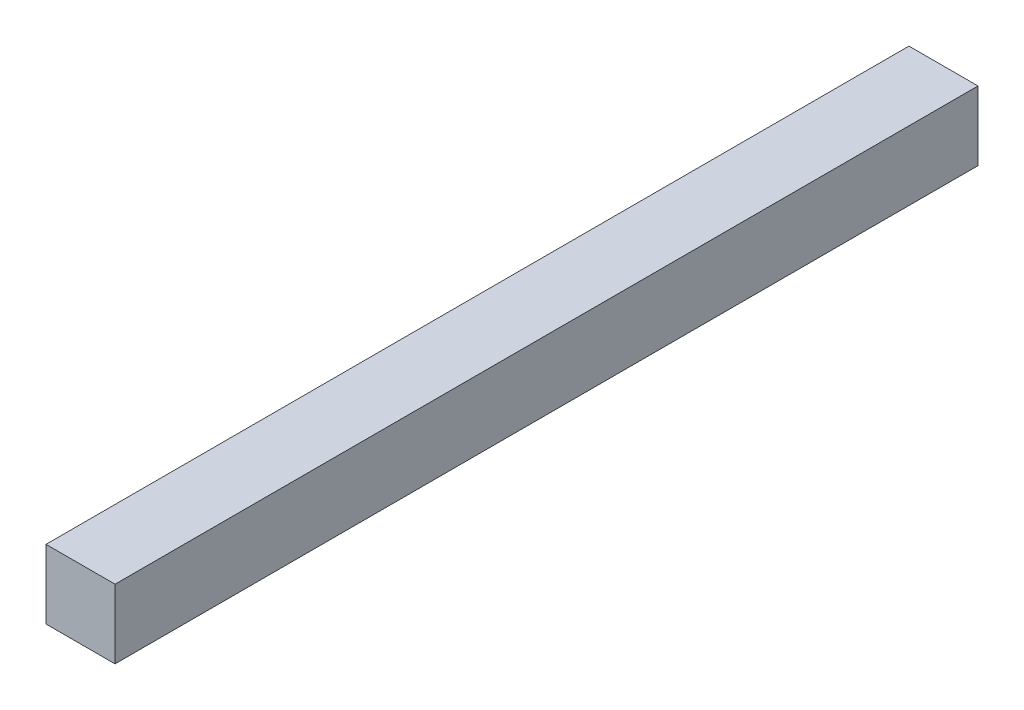
ISO-10303-21;
HEADER;
FILE_DESCRIPTION(('STEP AP214'),'2;1');
FILE_NAME('part.step','',(''),(''),'','','');
FILE_SCHEMA(('AUTOMOTIVE_DESIGN { 1 0 10303 214 1 1 1 1 }'));
ENDSEC;
DATA;
#1=APPLICATION_CONTEXT('core data for automotive mechanical design processes');
#2=APPLICATION_PROTOCOL_DEFINITION('international standard','automotive_design',2000,#1);
#3=PRODUCT_CONTEXT('',#1,'mechanical');
#4=PRODUCT('Part','Part','',(#3));
#5=PRODUCT_RELATED_PRODUCT_CATEGORY('part','',(#4));
#6=PRODUCT_DEFINITION_FORMATION('','',#4);
#7=PRODUCT_DEFINITION_CONTEXT('part definition',#1,'design');
#8=PRODUCT_DEFINITION('design','',#6,#7);
#9=PRODUCT_DEFINITION_SHAPE('','',#8);
#10=(LENGTH_UNIT() NAMED_UNIT(*) SI_UNIT(.MILLI.,.METRE.));
#11=(NAMED_UNIT(*) PLANE_ANGLE_UNIT() SI_UNIT($,.RADIAN.));
#12=(NAMED_UNIT(*) SI_UNIT($,.STERADIAN.) SOLID_ANGLE_UNIT());
#13=UNCERTAINTY_MEASURE_WITH_UNIT(LENGTH_MEASURE(1.E-05),#10,'distance_accuracy_value','');
#14=(GEOMETRIC_REPRESENTATION_CONTEXT(3) GLOBAL_UNCERTAINTY_ASSIGNED_CONTEXT((#13)) GLOBAL_UNIT_ASSIGNED_CONTEXT((#10,
#11,#12)) REPRESENTATION_CONTEXT('',''));
#15=CARTESIAN_POINT('',(0.,0.,0.));
#16=DIRECTION('',(0.,0.,1.));
#17=DIRECTION('',(1.,0.,0.));
#18=AXIS2_PLACEMENT_3D('',#15,#16,#17);
#19=CARTESIAN_POINT('',(10.,10.,250.));
#20=DIRECTION('',(-1.,0.,0.));
#21=DIRECTION('',(0.,-1.,0.));
#22=AXIS2_PLACEMENT_3D('',#19,#20,#21);
#23=PLANE('',#22);
#24=DIRECTION('',(0.,1.,0.));
#25=VECTOR('',#24,1.);
#26=CARTESIAN_POINT('',(10.,10.,0.));
#27=LINE('',#26,#25);
#28=CARTESIAN_POINT('',(10.,-10.,0.));
#29=VERTEX_POINT('',#28);
#30=CARTESIAN_POINT('',(10.,10.,0.));
#31=VERTEX_POINT('',#30);
#32=EDGE_CURVE('E102',#29,#31,#27,.T.);
#33=ORIENTED_EDGE('',*,*,#32,.T.);
#34=DIRECTION('',(0.,0.,-1.));
#35=VECTOR('',#34,1.);
#36=CARTESIAN_POINT('',(10.,10.,250.));
#37=LINE('',#36,#35);
#38=CARTESIAN_POINT('',(10.,10.,250.));
#39=VERTEX_POINT('',#38);
#40=EDGE_CURVE('E11',#39,#31,#37,.T.);
#41=ORIENTED_EDGE('',*,*,#40,.F.);
#42=DIRECTION('',(0.,1.,0.));
#43=VECTOR('',#42,1.);
#44=CARTESIAN_POINT('',(10.,10.,250.));
#45=LINE('',#44,#43);
#46=CARTESIAN_POINT('',(10.,-10.,250.));
#47=VERTEX_POINT('',#46);
#48=EDGE_CURVE('E90',#47,#39,#45,.T.);
#49=ORIENTED_EDGE('',*,*,#48,.F.);
#50=DIRECTION('',(0.,0.,-1.));
#51=VECTOR('',#50,1.);
#52=CARTESIAN_POINT('',(10.,-10.,250.));
#53=LINE('',#52,#51);
#54=EDGE_CURVE('E98',#47,#29,#53,.T.);
#55=ORIENTED_EDGE('',*,*,#54,.T.);
#56=EDGE_LOOP('',(#33,#41,#49,#55));
#57=FACE_BOUND('',#56,.T.);
#58=ADVANCED_FACE('F39',(#57),#23,.F.);
#59=CARTESIAN_POINT('',(-10.,10.,250.));
#60=DIRECTION('',(0.,-1.,0.));
#61=DIRECTION('',(0.,0.,-1.));
#62=AXIS2_PLACEMENT_3D('',#59,#60,#61);
#63=PLANE('',#62);
#64=DIRECTION('',(-1.,0.,0.));
#65=VECTOR('',#64,1.);
#66=CARTESIAN_POINT('',(-10.,10.,0.));
#67=LINE('',#66,#65);
#68=CARTESIAN_POINT('',(-10.,10.,0.));
#69=VERTEX_POINT('',#68);
#70=EDGE_CURVE('E94',#31,#69,#67,.T.);
#71=ORIENTED_EDGE('',*,*,#70,.T.);
#72=DIRECTION('',(0.,0.,-1.));
#73=VECTOR('',#72,1.);
#74=CARTESIAN_POINT('',(-10.,10.,250.));
#75=LINE('',#74,#73);
#76=CARTESIAN_POINT('',(-10.,10.,250.));
#77=VERTEX_POINT('',#76);
#78=EDGE_CURVE('E47',#77,#69,#75,.T.);
#79=ORIENTED_EDGE('',*,*,#78,.F.);
#80=DIRECTION('',(-1.,0.,0.));
#81=VECTOR('',#80,1.);
#82=CARTESIAN_POINT('',(-10.,10.,250.));
#83=LINE('',#82,#81);
#84=EDGE_CURVE('E85',#39,#77,#83,.T.);
#85=ORIENTED_EDGE('',*,*,#84,.F.);
#86=ORIENTED_EDGE('',*,*,#40,.T.);
#87=EDGE_LOOP('',(#71,#79,#85,#86));
#88=FACE_BOUND('',#87,.T.);
#89=ADVANCED_FACE('F93',(#88),#63,.F.);
#90=CARTESIAN_POINT('',(-10.,10.,250.));
#91=DIRECTION('',(1.,0.,0.));
#92=DIRECTION('',(0.,1.,0.));
#93=AXIS2_PLACEMENT_3D('',#90,#91,#92);
#94=PLANE('',#93);
#95=DIRECTION('',(0.,-1.,0.));
#96=VECTOR('',#95,1.);
#97=CARTESIAN_POINT('',(-10.,10.,0.));
#98=LINE('',#97,#96);
#99=CARTESIAN_POINT('',(-10.,-10.,0.));
#100=VERTEX_POINT('',#99);
#101=EDGE_CURVE('E72',#69,#100,#98,.T.);
#102=ORIENTED_EDGE('',*,*,#101,.T.);
#103=DIRECTION('',(0.,0.,-1.));
#104=VECTOR('',#103,1.);
#105=CARTESIAN_POINT('',(-10.,-10.,250.));
#106=LINE('',#105,#104);
#107=CARTESIAN_POINT('',(-10.,-10.,250.));
#108=VERTEX_POINT('',#107);
#109=EDGE_CURVE('E95',#108,#100,#106,.T.);
#110=ORIENTED_EDGE('',*,*,#109,.F.);
#111=DIRECTION('',(0.,-1.,0.));
#112=VECTOR('',#111,1.);
#113=CARTESIAN_POINT('',(-10.,10.,250.));
#114=LINE('',#113,#112);
#115=EDGE_CURVE('E88',#77,#108,#114,.T.);
#116=ORIENTED_EDGE('',*,*,#115,.F.);
#117=ORIENTED_EDGE('',*,*,#78,.T.);
#118=EDGE_LOOP('',(#102,#110,#116,#117));
#119=FACE_BOUND('',#118,.T.);
#120=ADVANCED_FACE('F96',(#119),#94,.F.);
#121=CARTESIAN_POINT('',(-10.,-10.,250.));
#122=DIRECTION('',(0.,1.,0.));
#123=DIRECTION('',(0.,0.,1.));
#124=AXIS2_PLACEMENT_3D('',#121,#122,#123);
#125=PLANE('',#124);
#126=DIRECTION('',(1.,0.,0.));
#127=VECTOR('',#126,1.);
#128=CARTESIAN_POINT('',(-10.,-10.,0.));
#129=LINE('',#128,#127);
#130=EDGE_CURVE('E78',#100,#29,#129,.T.);
#131=ORIENTED_EDGE('',*,*,#130,.T.);
#132=ORIENTED_EDGE('',*,*,#54,.F.);
#133=DIRECTION('',(1.,0.,0.));
#134=VECTOR('',#133,1.);
#135=CARTESIAN_POINT('',(-10.,-10.,250.));
#136=LINE('',#135,#134);
#137=EDGE_CURVE('E55',#108,#47,#136,.T.);
#138=ORIENTED_EDGE('',*,*,#137,.F.);
#139=ORIENTED_EDGE('',*,*,#109,.T.);
#140=EDGE_LOOP('',(#131,#132,#138,#139));
#141=FACE_BOUND('',#140,.T.);
#142=ADVANCED_FACE('F109',(#141),#125,.F.);
#143=CARTESIAN_POINT('',(0.,0.,250.));
#144=DIRECTION('',(0.,0.,1.));
#145=DIRECTION('',(1.,0.,0.));
#146=AXIS2_PLACEMENT_3D('',#143,#144,#145);
#147=PLANE('',#146);
#148=ORIENTED_EDGE('',*,*,#48,.T.);
#149=ORIENTED_EDGE('',*,*,#84,.T.);
#150=ORIENTED_EDGE('',*,*,#115,.T.);
#151=ORIENTED_EDGE('',*,*,#137,.T.);
#152=EDGE_LOOP('',(#148,#149,#150,#151));
#153=FACE_BOUND('',#152,.T.);
#154=ADVANCED_FACE('F86',(#153),#147,.T.);
#155=CARTESIAN_POINT('',(0.,0.,0.));
#156=DIRECTION('',(0.,0.,1.));
#157=DIRECTION('',(1.,0.,0.));
#158=AXIS2_PLACEMENT_3D('',#155,#156,#157);
#159=PLANE('',#158);
#160=ORIENTED_EDGE('',*,*,#32,.F.);
#161=ORIENTED_EDGE('',*,*,#130,.F.);
#162=ORIENTED_EDGE('',*,*,#101,.F.);
#163=ORIENTED_EDGE('',*,*,#70,.F.);
#164=EDGE_LOOP('',(#160,#161,#162,#163));
#165=FACE_BOUND('',#164,.T.);
#166=ADVANCED_FACE('F112',(#165),#159,.F.);
#167=CLOSED_SHELL('',(#58,#89,#120,#142,#154,#166));
#168=MANIFOLD_SOLID_BREP('B2',#167);
#169=ADVANCED_BREP_SHAPE_REPRESENTATION('',(#18,#168),#14);
#170=SHAPE_DEFINITION_REPRESENTATION(#9,#169);
ENDSEC;
END-ISO-10303-21;
